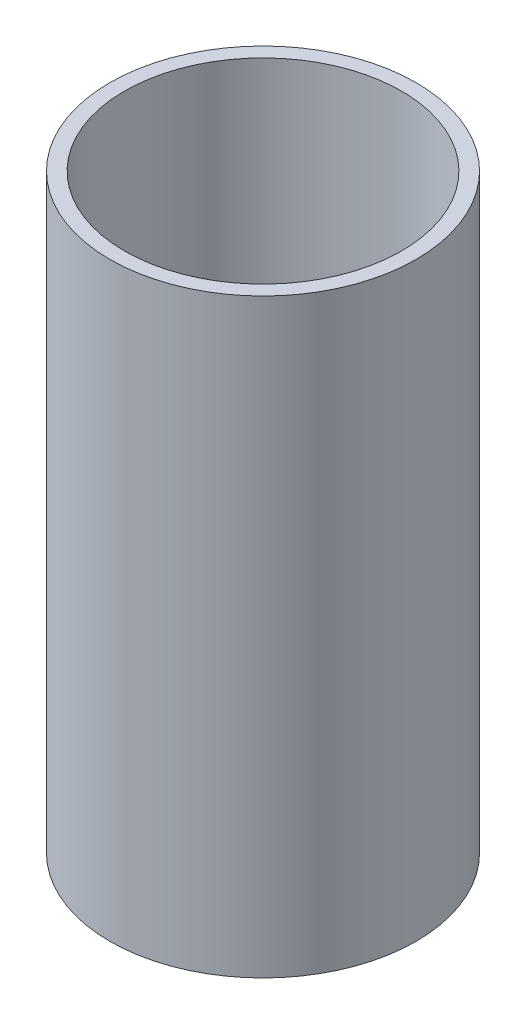
ISO-10303-21;
HEADER;
FILE_DESCRIPTION(('STEP AP214'),'2;1');
FILE_NAME('part.step','',(''),(''),'','','');
FILE_SCHEMA(('AUTOMOTIVE_DESIGN { 1 0 10303 214 1 1 1 1 }'));
ENDSEC;
DATA;
#1=APPLICATION_CONTEXT('core data for automotive mechanical design processes');
#2=APPLICATION_PROTOCOL_DEFINITION('international standard','automotive_design',2000,#1);
#3=PRODUCT_CONTEXT('',#1,'mechanical');
#4=PRODUCT('Part','Part','',(#3));
#5=PRODUCT_RELATED_PRODUCT_CATEGORY('part','',(#4));
#6=PRODUCT_DEFINITION_FORMATION('','',#4);
#7=PRODUCT_DEFINITION_CONTEXT('part definition',#1,'design');
#8=PRODUCT_DEFINITION('design','',#6,#7);
#9=PRODUCT_DEFINITION_SHAPE('','',#8);
#10=(LENGTH_UNIT() NAMED_UNIT(*) SI_UNIT(.MILLI.,.METRE.));
#11=(NAMED_UNIT(*) PLANE_ANGLE_UNIT() SI_UNIT($,.RADIAN.));
#12=(NAMED_UNIT(*) SI_UNIT($,.STERADIAN.) SOLID_ANGLE_UNIT());
#13=UNCERTAINTY_MEASURE_WITH_UNIT(LENGTH_MEASURE(1.E-05),#10,'distance_accuracy_value','');
#14=(GEOMETRIC_REPRESENTATION_CONTEXT(3) GLOBAL_UNCERTAINTY_ASSIGNED_CONTEXT((#13)) GLOBAL_UNIT_ASSIGNED_CONTEXT((#10,
#11,#12)) REPRESENTATION_CONTEXT('',''));
#15=CARTESIAN_POINT('',(0.,0.,0.));
#16=DIRECTION('',(0.,0.,1.));
#17=DIRECTION('',(1.,0.,0.));
#18=AXIS2_PLACEMENT_3D('',#15,#16,#17);
#19=CARTESIAN_POINT('',(0.,40.5,0.));
#20=DIRECTION('',(0.,-1.,0.));
#21=DIRECTION('',(0.,0.,-1.));
#22=AXIS2_PLACEMENT_3D('',#19,#20,#21);
#23=CYLINDRICAL_SURFACE('',#22,10.5);
#24=CARTESIAN_POINT('',(0.,40.5,0.));
#25=DIRECTION('',(0.,1.,0.));
#26=DIRECTION('',(0.,0.,1.));
#27=AXIS2_PLACEMENT_3D('',#24,#25,#26);
#28=CIRCLE('',#27,10.5);
#29=CARTESIAN_POINT('',(0.,40.5,10.5));
#30=VERTEX_POINT('',#29);
#31=EDGE_CURVE('E10',#30,#30,#28,.T.);
#32=ORIENTED_EDGE('',*,*,#31,.F.);
#33=EDGE_LOOP('',(#32));
#34=FACE_BOUND('',#33,.T.);
#35=CARTESIAN_POINT('',(0.,0.,0.));
#36=DIRECTION('',(0.,1.,0.));
#37=DIRECTION('',(0.,0.,1.));
#38=AXIS2_PLACEMENT_3D('',#35,#36,#37);
#39=CIRCLE('',#38,10.5);
#40=CARTESIAN_POINT('',(0.,0.,10.5));
#41=VERTEX_POINT('',#40);
#42=EDGE_CURVE('E34',#41,#41,#39,.T.);
#43=ORIENTED_EDGE('',*,*,#42,.T.);
#44=EDGE_LOOP('',(#43));
#45=FACE_BOUND('',#44,.T.);
#46=ADVANCED_FACE('F31',(#34,#45),#23,.T.);
#47=CARTESIAN_POINT('',(0.,40.5,0.));
#48=DIRECTION('',(0.,1.,0.));
#49=DIRECTION('',(0.,0.,1.));
#50=AXIS2_PLACEMENT_3D('',#47,#48,#49);
#51=PLANE('',#50);
#52=CARTESIAN_POINT('',(0.,40.5,0.));
#53=DIRECTION('',(0.,1.,0.));
#54=DIRECTION('',(0.,0.,1.));
#55=AXIS2_PLACEMENT_3D('',#52,#53,#54);
#56=CIRCLE('',#55,9.5);
#57=CARTESIAN_POINT('',(0.,40.5,9.5));
#58=VERTEX_POINT('',#57);
#59=EDGE_CURVE('E41',#58,#58,#56,.T.);
#60=ORIENTED_EDGE('',*,*,#59,.F.);
#61=EDGE_LOOP('',(#60));
#62=FACE_BOUND('',#61,.T.);
#63=ORIENTED_EDGE('',*,*,#31,.T.);
#64=EDGE_LOOP('',(#63));
#65=FACE_BOUND('',#64,.T.);
#66=ADVANCED_FACE('F61',(#62,#65),#51,.T.);
#67=CARTESIAN_POINT('',(0.,0.,0.));
#68=DIRECTION('',(0.,1.,0.));
#69=DIRECTION('',(0.,0.,1.));
#70=AXIS2_PLACEMENT_3D('',#67,#68,#69);
#71=PLANE('',#70);
#72=ORIENTED_EDGE('',*,*,#42,.F.);
#73=EDGE_LOOP('',(#72));
#74=FACE_BOUND('',#73,.T.);
#75=ADVANCED_FACE('F53',(#74),#71,.F.);
#76=CARTESIAN_POINT('',(0.,40.5,0.));
#77=DIRECTION('',(0.,-1.,0.));
#78=DIRECTION('',(0.,0.,-1.));
#79=AXIS2_PLACEMENT_3D('',#76,#77,#78);
#80=CYLINDRICAL_SURFACE('',#79,9.5);
#81=ORIENTED_EDGE('',*,*,#59,.T.);
#82=EDGE_LOOP('',(#81));
#83=FACE_BOUND('',#82,.T.);
#84=CARTESIAN_POINT('',(0.,1.,0.));
#85=DIRECTION('',(0.,1.,0.));
#86=DIRECTION('',(0.,0.,1.));
#87=AXIS2_PLACEMENT_3D('',#84,#85,#86);
#88=CIRCLE('',#87,9.5);
#89=CARTESIAN_POINT('',(0.,1.,9.5));
#90=VERTEX_POINT('',#89);
#91=EDGE_CURVE('E45',#90,#90,#88,.T.);
#92=ORIENTED_EDGE('',*,*,#91,.F.);
#93=EDGE_LOOP('',(#92));
#94=FACE_BOUND('',#93,.T.);
#95=ADVANCED_FACE('F51',(#83,#94),#80,.F.);
#96=CARTESIAN_POINT('',(0.,1.,0.));
#97=DIRECTION('',(0.,1.,0.));
#98=DIRECTION('',(0.,0.,1.));
#99=AXIS2_PLACEMENT_3D('',#96,#97,#98);
#100=PLANE('',#99);
#101=ORIENTED_EDGE('',*,*,#91,.T.);
#102=EDGE_LOOP('',(#101));
#103=FACE_BOUND('',#102,.T.);
#104=ADVANCED_FACE('F49',(#103),#100,.T.);
#105=CLOSED_SHELL('',(#46,#66,#75,#95,#104));
#106=MANIFOLD_SOLID_BREP('B2',#105);
#107=ADVANCED_BREP_SHAPE_REPRESENTATION('',(#18,#106),#14);
#108=SHAPE_DEFINITION_REPRESENTATION(#9,#107);
ENDSEC;
END-ISO-10303-21;
